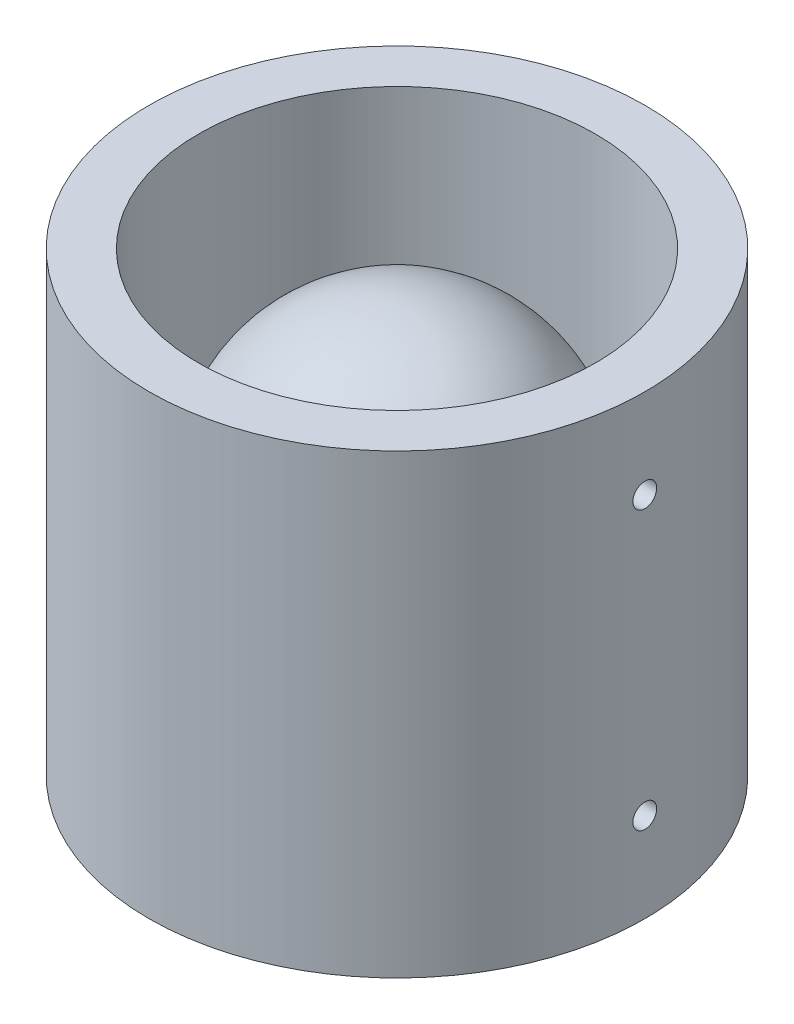
ISO-10303-21;
HEADER;
FILE_DESCRIPTION(('STEP AP214'),'2;1');
FILE_NAME('part.step','',(''),(''),'','','');
FILE_SCHEMA(('AUTOMOTIVE_DESIGN { 1 0 10303 214 1 1 1 1 }'));
ENDSEC;
DATA;
#1=APPLICATION_CONTEXT('core data for automotive mechanical design processes');
#2=APPLICATION_PROTOCOL_DEFINITION('international standard','automotive_design',2000,#1);
#3=PRODUCT_CONTEXT('',#1,'mechanical');
#4=PRODUCT('Part','Part','',(#3));
#5=PRODUCT_RELATED_PRODUCT_CATEGORY('part','',(#4));
#6=PRODUCT_DEFINITION_FORMATION('','',#4);
#7=PRODUCT_DEFINITION_CONTEXT('part definition',#1,'design');
#8=PRODUCT_DEFINITION('design','',#6,#7);
#9=PRODUCT_DEFINITION_SHAPE('','',#8);
#10=(LENGTH_UNIT() NAMED_UNIT(*) SI_UNIT(.MILLI.,.METRE.));
#11=(NAMED_UNIT(*) PLANE_ANGLE_UNIT() SI_UNIT($,.RADIAN.));
#12=(NAMED_UNIT(*) SI_UNIT($,.STERADIAN.) SOLID_ANGLE_UNIT());
#13=UNCERTAINTY_MEASURE_WITH_UNIT(LENGTH_MEASURE(1.E-05),#10,'distance_accuracy_value','');
#14=(GEOMETRIC_REPRESENTATION_CONTEXT(3) GLOBAL_UNCERTAINTY_ASSIGNED_CONTEXT((#13)) GLOBAL_UNIT_ASSIGNED_CONTEXT((#10,
#11,#12)) REPRESENTATION_CONTEXT('',''));
#15=CARTESIAN_POINT('',(0.,0.,0.));
#16=DIRECTION('',(0.,0.,1.));
#17=DIRECTION('',(1.,0.,0.));
#18=AXIS2_PLACEMENT_3D('',#15,#16,#17);
#19=CARTESIAN_POINT('',(0.,12.0756756756757,0.));
#20=DIRECTION('',(0.,-1.,0.));
#21=DIRECTION('',(1.,0.,0.));
#22=AXIS2_PLACEMENT_3D('',#19,#20,#21);
#23=SPHERICAL_SURFACE('',#22,6.82432432432432);
#24=CARTESIAN_POINT('',(0.,11.5,0.));
#25=DIRECTION('',(0.,-1.,0.));
#26=DIRECTION('',(0.,0.,-1.));
#27=AXIS2_PLACEMENT_3D('',#24,#25,#26);
#28=CIRCLE('',#27,6.8);
#29=CARTESIAN_POINT('',(0.,11.5,-6.8));
#30=VERTEX_POINT('',#29);
#31=EDGE_CURVE('E10',#30,#30,#28,.T.);
#32=ORIENTED_EDGE('',*,*,#31,.T.);
#33=EDGE_LOOP('',(#32));
#34=FACE_BOUND('',#33,.T.);
#35=ADVANCED_FACE('F37',(#34),#23,.F.);
#36=CARTESIAN_POINT('',(0.,11.5,0.));
#37=DIRECTION('',(0.,1.,0.));
#38=DIRECTION('',(0.,0.,1.));
#39=AXIS2_PLACEMENT_3D('',#36,#37,#38);
#40=PLANE('',#39);
#41=ORIENTED_EDGE('',*,*,#31,.F.);
#42=EDGE_LOOP('',(#41));
#43=FACE_BOUND('',#42,.T.);
#44=CARTESIAN_POINT('',(0.,11.5,0.));
#45=DIRECTION('',(0.,-1.,0.));
#46=DIRECTION('',(0.,0.,-1.));
#47=AXIS2_PLACEMENT_3D('',#44,#45,#46);
#48=CIRCLE('',#47,9.99999999999999);
#49=CARTESIAN_POINT('',(0.,11.5,-9.99999999999999));
#50=VERTEX_POINT('',#49);
#51=EDGE_CURVE('E43',#50,#50,#48,.T.);
#52=ORIENTED_EDGE('',*,*,#51,.T.);
#53=EDGE_LOOP('',(#52));
#54=FACE_BOUND('',#53,.T.);
#55=ADVANCED_FACE('F128',(#43,#54),#40,.F.);
#56=CARTESIAN_POINT('',(0.,0.,0.));
#57=DIRECTION('',(0.,-1.,0.));
#58=DIRECTION('',(0.,0.,-1.));
#59=AXIS2_PLACEMENT_3D('',#56,#57,#58);
#60=CYLINDRICAL_SURFACE('',#59,9.99999999999999);
#61=CARTESIAN_POINT('',(9.98198377077422,4.5,-0.6));
#62=CARTESIAN_POINT('',(9.98198401201266,4.46633029699841,-0.599998517471414));
#63=CARTESIAN_POINT('',(9.98215595678526,4.43263695259193,-0.597156354895668));
#64=CARTESIAN_POINT('',(9.98282524653582,4.36618043051532,-0.585859096831607));
#65=CARTESIAN_POINT('',(9.9833229712693,4.33341838500508,-0.577397450649356));
#66=CARTESIAN_POINT('',(9.98458724111525,4.26979672371531,-0.555104977990247));
#67=CARTESIAN_POINT('',(9.98535364536831,4.2389361210232,-0.541276964509292));
#68=CARTESIAN_POINT('',(9.98706873955508,4.17998219709892,-0.508648784748044));
#69=CARTESIAN_POINT('',(9.98801738745489,4.1518882400046,-0.489849764638794));
#70=CARTESIAN_POINT('',(9.98999157888623,4.09921773322034,-0.447784352817085));
#71=CARTESIAN_POINT('',(9.99101721555019,4.07464555177201,-0.42451249550801));
#72=CARTESIAN_POINT('',(9.99302894926315,4.02975346763584,-0.374173227142782));
#73=CARTESIAN_POINT('',(9.99401504466929,4.00943374148068,-0.347105658592687));
#74=CARTESIAN_POINT('',(9.99583736833412,3.97361026358255,-0.289919070083357));
#75=CARTESIAN_POINT('',(9.99667348547989,3.95811007626022,-0.25979781341439));
#76=CARTESIAN_POINT('',(9.99810066684227,3.93238850322372,-0.197374580626783));
#77=CARTESIAN_POINT('',(9.99869173351435,3.92216706461498,-0.165072626363023));
#78=CARTESIAN_POINT('',(9.9995615743073,3.90730512175699,-0.0992465731113257));
#79=CARTESIAN_POINT('',(9.99984072723837,3.90265784734145,-0.0657240077489312));
#80=CARTESIAN_POINT('',(10.0000565601673,3.89905524762713,0.00162647869639034));
#81=CARTESIAN_POINT('',(9.99999324377188,3.90009986238483,0.0354543965597856));
#82=CARTESIAN_POINT('',(9.99953158937064,3.90784579641701,0.102409483640516));
#83=CARTESIAN_POINT('',(9.99913368274436,3.91453983206318,0.135537498876275));
#84=CARTESIAN_POINT('',(9.99804814710845,3.93338328853479,0.200198802329734));
#85=CARTESIAN_POINT('',(9.9973605164938,3.94553273958228,0.231732081711798));
#86=CARTESIAN_POINT('',(9.99577222039045,3.97495040858791,0.292332195931485));
#87=CARTESIAN_POINT('',(9.99487141744278,3.99222193121584,0.321397422804533));
#88=CARTESIAN_POINT('',(9.99295816926915,4.03139106207923,0.376218813487536));
#89=CARTESIAN_POINT('',(9.99194572288875,4.05328871815288,0.401974943074147));
#90=CARTESIAN_POINT('',(9.98992126372086,4.10112966683711,0.449489521907771));
#91=CARTESIAN_POINT('',(9.98890925413119,4.12707928076594,0.471241607059719));
#92=CARTESIAN_POINT('',(9.98700135868553,4.18226537094141,0.510081576134667));
#93=CARTESIAN_POINT('',(9.986105472872,4.21150184838995,0.527169458352121));
#94=CARTESIAN_POINT('',(9.98453098174426,4.27243575001595,0.556195483697502));
#95=CARTESIAN_POINT('',(9.9838523874765,4.30413329920497,0.56813336502597));
#96=CARTESIAN_POINT('',(9.98278940556902,4.36908773863782,0.586516153179477));
#97=CARTESIAN_POINT('',(9.98240501474084,4.40234461197816,0.592961119534703));
#98=CARTESIAN_POINT('',(9.98197438414036,4.46941816230764,0.600167212491188));
#99=CARTESIAN_POINT('',(9.98192761823906,4.50323388595765,0.600937182614));
#100=CARTESIAN_POINT('',(9.98217613712487,4.57051401621661,0.596794526461524));
#101=CARTESIAN_POINT('',(9.98247142027366,4.6039784245075,0.591881927404156));
#102=CARTESIAN_POINT('',(9.98337027924552,4.6695810203571,0.57652092722602));
#103=CARTESIAN_POINT('',(9.98397362853823,4.70172016368206,0.566076593547018));
#104=CARTESIAN_POINT('',(9.98542043237127,4.7637894049039,0.539952719606716));
#105=CARTESIAN_POINT('',(9.98626388891815,4.79371948433721,0.524273135594714));
#106=CARTESIAN_POINT('',(9.98809713085294,4.85056162857903,0.48810122662252));
#107=CARTESIAN_POINT('',(9.98908709594341,4.87746991463933,0.467602972809795));
#108=CARTESIAN_POINT('',(9.99110116089288,4.92746659077687,0.422384230608711));
#109=CARTESIAN_POINT('',(9.99212526106073,4.95055494627977,0.397663704008519));
#110=CARTESIAN_POINT('',(9.99409372687306,4.99228620563304,0.344664096943035));
#111=CARTESIAN_POINT('',(9.99503798891735,5.01092338901876,0.316380507882732));
#112=CARTESIAN_POINT('',(9.99673888695872,5.04318412656692,0.257080341335411));
#113=CARTESIAN_POINT('',(9.99749552403932,5.05680770968266,0.226063779632465));
#114=CARTESIAN_POINT('',(9.99873541734025,5.07864456140467,0.162199199042471));
#115=CARTESIAN_POINT('',(9.9992188568999,5.08686145897782,0.129352424688534));
#116=CARTESIAN_POINT('',(9.99985861043105,5.09766356998899,0.0627424887048632));
#117=CARTESIAN_POINT('',(10.0000149273218,5.10024883368462,0.0289793352557667));
#118=CARTESIAN_POINT('',(9.99998283121432,5.09971380806371,-0.0384482932984699));
#119=CARTESIAN_POINT('',(9.99979495938778,5.09660247557385,-0.0721128400987228));
#120=CARTESIAN_POINT('',(9.99909669083327,5.08478113580375,-0.13844062762014));
#121=CARTESIAN_POINT('',(9.99858629352841,5.07607111850935,-0.171103866550195));
#122=CARTESIAN_POINT('',(9.99730035413457,5.05330163934932,-0.234503300307763));
#123=CARTESIAN_POINT('',(9.99652481296466,5.03924219602669,-0.265239501814638));
#124=CARTESIAN_POINT('',(9.99479569274723,5.00617425762829,-0.32391619783375));
#125=CARTESIAN_POINT('',(9.99384211850181,4.98716589603499,-0.351856767721767));
#126=CARTESIAN_POINT('',(9.99186243901885,4.94470676574869,-0.404194384504062));
#127=CARTESIAN_POINT('',(9.99083623006023,4.92124956056174,-0.428586205652784));
#128=CARTESIAN_POINT('',(9.98882774883929,4.87056652217833,-0.473094054248563));
#129=CARTESIAN_POINT('',(9.98784548740359,4.84333976702956,-0.493209032609014));
#130=CARTESIAN_POINT('',(9.98603481255707,4.78586150200958,-0.528605904532304));
#131=CARTESIAN_POINT('',(9.98520658194916,4.75560646283758,-0.543882070342837));
#132=CARTESIAN_POINT('',(9.98380010736925,4.69297815205819,-0.569119208964382));
#133=CARTESIAN_POINT('',(9.98322157021377,4.6606074163762,-0.579086418650936));
#134=CARTESIAN_POINT('',(9.98253189126873,4.60669829869281,-0.590826934595602));
#135=CARTESIAN_POINT('',(9.98232726196914,4.58550854605257,-0.594262398212309));
#136=CARTESIAN_POINT('',(9.98205312497913,4.5428823925691,-0.598849401611936));
#137=CARTESIAN_POINT('',(9.98198361711686,4.52144599203962,-0.600000944299872));
#138=CARTESIAN_POINT('',(9.98198377077422,4.5,-0.6));
#139=B_SPLINE_CURVE_WITH_KNOTS('',3,(#61,#62,#63,#64,#65,#66,#67,#68,#69,#70,#71,#72,#73,#74,
#75,#76,#77,#78,#79,#80,#81,#82,#83,#84,#85,#86,#87,#88,#89,#90,#91,#92,#93,#94,#95,#96,#97,#98,
#99,#100,#101,#102,#103,#104,#105,#106,#107,#108,#109,#110,#111,#112,#113,#114,#115,#116,#117,
#118,#119,#120,#121,#122,#123,#124,#125,#126,#127,#128,#129,#130,#131,#132,#133,#134,#135,#136,
#137,#138),.UNSPECIFIED.,.T.,.F.,(4,2,2,2,2,2,2,2,2,2,2,2,2,2,2,2,2,2,2,2,2,2,2,2,2,2,2,2,2,2,2,
2,2,2,2,2,2,2,4),(0.,0.100930818882167,0.201979500938155,0.30297528567975,0.403947803974872,
0.505044499524723,0.606145391081563,0.707320877665383,0.808495350422211,0.909546815704642,
1.01059721677675,1.11151753528352,1.21243841287812,1.31342454501592,1.41441172148833,
1.51555804826418,1.61670441202589,1.71785591694087,1.81900632559922,1.91999907506486,
2.02099134080545,2.12190945059531,2.22282840377345,2.323872182797,2.42491687632151,
2.5260907378854,2.62726401516577,2.72836931549229,2.8294737135352,2.93041928041172,
3.03136502784614,3.13231042537013,3.23325310047191,3.33434294704152,3.43545756187376,
3.53669142366835,3.63780609378394,3.70209428460643,3.76638239365798),.UNSPECIFIED.);
#140=CARTESIAN_POINT('',(9.98198377077422,4.5,-0.6));
#141=VERTEX_POINT('',#140);
#142=EDGE_CURVE('E69',#141,#141,#139,.T.);
#143=ORIENTED_EDGE('',*,*,#142,.F.);
#144=EDGE_LOOP('',(#143));
#145=FACE_BOUND('',#144,.T.);
#146=ORIENTED_EDGE('',*,*,#51,.F.);
#147=EDGE_LOOP('',(#146));
#148=FACE_BOUND('',#147,.T.);
#149=CARTESIAN_POINT('',(0.,0.,0.));
#150=DIRECTION('',(0.,-1.,0.));
#151=DIRECTION('',(0.,0.,-1.));
#152=AXIS2_PLACEMENT_3D('',#149,#150,#151);
#153=CIRCLE('',#152,9.99999999999999);
#154=CARTESIAN_POINT('',(0.,0.,-9.99999999999999));
#155=VERTEX_POINT('',#154);
#156=EDGE_CURVE('E47',#155,#155,#153,.T.);
#157=ORIENTED_EDGE('',*,*,#156,.T.);
#158=EDGE_LOOP('',(#157));
#159=FACE_BOUND('',#158,.T.);
#160=ADVANCED_FACE('F114',(#145,#148,#159),#60,.F.);
#161=CARTESIAN_POINT('',(0.,0.,0.));
#162=DIRECTION('',(0.,1.,0.));
#163=DIRECTION('',(0.,0.,1.));
#164=AXIS2_PLACEMENT_3D('',#161,#162,#163);
#165=PLANE('',#164);
#166=ORIENTED_EDGE('',*,*,#156,.F.);
#167=EDGE_LOOP('',(#166));
#168=FACE_BOUND('',#167,.T.);
#169=CARTESIAN_POINT('',(0.,0.,0.));
#170=DIRECTION('',(0.,-1.,0.));
#171=DIRECTION('',(0.,0.,-1.));
#172=AXIS2_PLACEMENT_3D('',#169,#170,#171);
#173=CIRCLE('',#172,12.5);
#174=CARTESIAN_POINT('',(0.,0.,-12.5));
#175=VERTEX_POINT('',#174);
#176=EDGE_CURVE('E51',#175,#175,#173,.T.);
#177=ORIENTED_EDGE('',*,*,#176,.T.);
#178=EDGE_LOOP('',(#177));
#179=FACE_BOUND('',#178,.T.);
#180=ADVANCED_FACE('F136',(#168,#179),#165,.F.);
#181=CARTESIAN_POINT('',(0.,0.,0.));
#182=DIRECTION('',(0.,-1.,0.));
#183=DIRECTION('',(0.,0.,-1.));
#184=AXIS2_PLACEMENT_3D('',#181,#182,#183);
#185=CYLINDRICAL_SURFACE('',#184,12.5);
#186=CARTESIAN_POINT('',(12.4855916960311,18.5,-0.6));
#187=CARTESIAN_POINT('',(12.4855918896883,18.4663185715794,-0.599998512917761));
#188=CARTESIAN_POINT('',(12.4857294505411,18.4326132151237,-0.597154378635558));
#189=CARTESIAN_POINT('',(12.4862649314358,18.3661321948238,-0.585848831179223));
#190=CARTESIAN_POINT('',(12.4866631587567,18.3333576759052,-0.577380788256306));
#191=CARTESIAN_POINT('',(12.4876747598637,18.2697110031604,-0.555070326476095));
#192=CARTESIAN_POINT('',(12.4882880245007,18.2388378935406,-0.541230633795579));
#193=CARTESIAN_POINT('',(12.4896604596653,18.1798614296477,-0.508573882821275));
#194=CARTESIAN_POINT('',(12.4904195955968,18.1517574210148,-0.489758004328909));
#195=CARTESIAN_POINT('',(12.4919990539936,18.0990819914248,-0.447663146868994));
#196=CARTESIAN_POINT('',(12.4928194263969,18.0745135025258,-0.424380500452055));
#197=CARTESIAN_POINT('',(12.4944284449003,18.0296314976752,-0.374020288211566));
#198=CARTESIAN_POINT('',(12.4952170897083,18.0093181548822,-0.346942568026376));
#199=CARTESIAN_POINT('',(12.4966741535277,17.9735152339121,-0.289745805730813));
#200=CARTESIAN_POINT('',(12.4973425164835,17.9580279023802,-0.259625355757314));
#201=CARTESIAN_POINT('',(12.49848319957,17.9323310623821,-0.197208063463376));
#202=CARTESIAN_POINT('',(12.4989555210989,17.9221215162778,-0.164911236665444));
#203=CARTESIAN_POINT('',(12.4996505638684,17.9072777018632,-0.099084615957952));
#204=CARTESIAN_POINT('',(12.4998734790519,17.9026391012788,-0.0655558010504624));
#205=CARTESIAN_POINT('',(12.5000452382189,17.8990554826695,0.00180527272665131));
#206=CARTESIAN_POINT('',(12.4999940842291,17.9001104225428,0.035637529350579));
#207=CARTESIAN_POINT('',(12.4996236333111,17.9078803393626,0.102615778199374));
#208=CARTESIAN_POINT('',(12.4993045573349,17.9145906524079,0.135762312858473));
#209=CARTESIAN_POINT('',(12.4984344594818,17.9334736060071,0.200457923384205));
#210=CARTESIAN_POINT('',(12.4978834366887,17.9456462681398,0.232006992939619));
#211=CARTESIAN_POINT('',(12.4966111378463,17.9751137049862,0.292627131564541));
#212=CARTESIAN_POINT('',(12.4958897911388,17.9924106062348,0.321697165382983));
#213=CARTESIAN_POINT('',(12.4943580865466,18.0316339708175,0.376522722918218));
#214=CARTESIAN_POINT('',(12.4935477280856,18.0535604641382,0.402278225164572));
#215=CARTESIAN_POINT('',(12.4919283017692,18.1014469700679,0.449770813851838));
#216=CARTESIAN_POINT('',(12.4911192360401,18.1274110289155,0.471503820775185));
#217=CARTESIAN_POINT('',(12.4895944291365,18.1826214208251,0.510303074489402));
#218=CARTESIAN_POINT('',(12.4888786879854,18.2118677547094,0.527369320111178));
#219=CARTESIAN_POINT('',(12.4876213054447,18.272814943283,0.556350236901598));
#220=CARTESIAN_POINT('',(12.4870796691525,18.3045158698017,0.568264757246676));
#221=CARTESIAN_POINT('',(12.4862317730225,18.369471268165,0.586601301562367));
#222=CARTESIAN_POINT('',(12.4859255115531,18.4027257292391,0.593023363606067));
#223=CARTESIAN_POINT('',(12.4855832028151,18.4698086932741,0.600187651964552));
#224=CARTESIAN_POINT('',(12.4855468862309,18.5036365903458,0.600935539243081));
#225=CARTESIAN_POINT('',(12.4857478595934,18.5709374065809,0.596745018744902));
#226=CARTESIAN_POINT('',(12.4859851487075,18.6044103268241,0.591806628273176));
#227=CARTESIAN_POINT('',(12.4867063423603,18.6700351280227,0.57638842930482));
#228=CARTESIAN_POINT('',(12.4871901316811,18.7021876185868,0.565911209656163));
#229=CARTESIAN_POINT('',(12.4883496991297,18.7642776416038,0.539715382388136));
#230=CARTESIAN_POINT('',(12.4890254782804,18.7942151622571,0.523996746848704));
#231=CARTESIAN_POINT('',(12.4904935129661,18.8510514776141,0.487749745205263));
#232=CARTESIAN_POINT('',(12.4912858604339,18.8779478439968,0.46721757520265));
#233=CARTESIAN_POINT('',(12.4928974004797,18.9279139394505,0.421931898159006));
#234=CARTESIAN_POINT('',(12.4937165932167,18.9509836458613,0.397178366122379));
#235=CARTESIAN_POINT('',(12.4952902776994,18.9926605652455,0.344128320465761));
#236=CARTESIAN_POINT('',(12.4960447161181,19.0112641224435,0.315828933018126));
#237=CARTESIAN_POINT('',(12.4974031019312,19.0434556664845,0.256505031415091));
#238=CARTESIAN_POINT('',(12.4980070499421,19.0570436738766,0.225480528425313));
#239=CARTESIAN_POINT('',(12.4989961330746,19.0788120084365,0.161600689378359));
#240=CARTESIAN_POINT('',(12.4993813629622,19.0869946778817,0.128746153024631));
#241=CARTESIAN_POINT('',(12.4998899701937,19.0977277320963,0.0621276568503126));
#242=CARTESIAN_POINT('',(12.5000133488619,19.1002781453525,0.0283637016302646));
#243=CARTESIAN_POINT('',(12.4999843548525,19.0996740144457,-0.0390788930102092));
#244=CARTESIAN_POINT('',(12.4998322594574,19.0965252069227,-0.0727575840880945));
#245=CARTESIAN_POINT('',(12.4992699872854,19.0846238704801,-0.139107601703904));
#246=CARTESIAN_POINT('',(12.4988598100185,19.0758713309242,-0.171778926329649));
#247=CARTESIAN_POINT('',(12.4978275280033,19.05301213286,-0.235188056600191));
#248=CARTESIAN_POINT('',(12.497205421369,19.0389054267074,-0.265925845036508));
#249=CARTESIAN_POINT('',(12.4958192608692,19.0057393772527,-0.324597002582852));
#250=CARTESIAN_POINT('',(12.495055211456,18.9866801892847,-0.352530459612366));
#251=CARTESIAN_POINT('',(12.4934703013177,18.9441298346345,-0.404828570429238));
#252=CARTESIAN_POINT('',(12.4926493902265,18.9206347061204,-0.429189999140271));
#253=CARTESIAN_POINT('',(12.4910436029896,18.8698813142214,-0.473630260691662));
#254=CARTESIAN_POINT('',(12.4902587357664,18.8426221256764,-0.493708037565163));
#255=CARTESIAN_POINT('',(12.4888130623952,18.7850942891104,-0.529019738769725));
#256=CARTESIAN_POINT('',(12.4881523711949,18.75482289199,-0.544249184041057));
#257=CARTESIAN_POINT('',(12.4870314075069,18.6921723861485,-0.569391344061627));
#258=CARTESIAN_POINT('',(12.4865708981327,18.6597958210597,-0.579310346197391));
#259=CARTESIAN_POINT('',(12.4860243035495,18.6060147324879,-0.590944972284193));
#260=CARTESIAN_POINT('',(12.4858627898815,18.5849586542844,-0.59433628013077));
#261=CARTESIAN_POINT('',(12.4856464249093,18.5426049092342,-0.598864263475562));
#262=CARTESIAN_POINT('',(12.4855915735214,18.5213072425774,-0.600000940744603));
#263=CARTESIAN_POINT('',(12.4855916960311,18.5,-0.6));
#264=B_SPLINE_CURVE_WITH_KNOTS('',3,(#186,#187,#188,#189,#190,#191,#192,#193,#194,#195,#196,
#197,#198,#199,#200,#201,#202,#203,#204,#205,#206,#207,#208,#209,#210,#211,#212,#213,#214,#215,
#216,#217,#218,#219,#220,#221,#222,#223,#224,#225,#226,#227,#228,#229,#230,#231,#232,#233,#234,
#235,#236,#237,#238,#239,#240,#241,#242,#243,#244,#245,#246,#247,#248,#249,#250,#251,#252,#253,
#254,#255,#256,#257,#258,#259,#260,#261,#262,#263),.UNSPECIFIED.,.T.,.F.,(4,2,2,2,2,2,2,2,2,2,2,
2,2,2,2,2,2,2,2,2,2,2,2,2,2,2,2,2,2,2,2,2,2,2,2,2,2,2,4),(0.,0.100966506293557,
0.202052248799716,0.303086756017561,0.404097330455401,0.505191197549289,0.606289177750642,
0.707434151864276,0.808578404661043,0.909643951078531,1.01070875015131,1.11169028406668,
1.21267221690589,1.31369611561056,1.41472066868172,1.51584712362973,1.6169736039114,
1.718103044604,1.81923178427331,1.92025961737409,2.02128714301886,2.12226749010712,
2.22324837510779,2.32430933092067,2.42537088515811,2.52651488360754,2.62765846765879,
2.7287581946899,2.82985741037668,2.93085491965103,3.03185262062674,3.13285122035524,
3.23384665265504,3.33493271649028,3.43604367042364,3.53724776496232,3.63833177077141,
3.70220434483829,3.76607686873858),.UNSPECIFIED.);
#265=CARTESIAN_POINT('',(12.4855916960311,18.5,-0.6));
#266=VERTEX_POINT('',#265);
#267=EDGE_CURVE('E68',#266,#266,#264,.T.);
#268=ORIENTED_EDGE('',*,*,#267,.T.);
#269=EDGE_LOOP('',(#268));
#270=FACE_BOUND('',#269,.T.);
#271=CARTESIAN_POINT('',(12.4855916960311,4.5,-0.6));
#272=CARTESIAN_POINT('',(12.4855918896883,4.46631857157943,-0.599998512917761));
#273=CARTESIAN_POINT('',(12.4857294505411,4.43261321512374,-0.597154378635558));
#274=CARTESIAN_POINT('',(12.4862649314358,4.3661321948238,-0.585848831179223));
#275=CARTESIAN_POINT('',(12.4866631587567,4.33335767590515,-0.577380788256305));
#276=CARTESIAN_POINT('',(12.4876747598637,4.26971100316039,-0.555070326476095));
#277=CARTESIAN_POINT('',(12.4882880245007,4.23883789354058,-0.541230633795579));
#278=CARTESIAN_POINT('',(12.4896604596653,4.17986142964771,-0.508573882821274));
#279=CARTESIAN_POINT('',(12.4904195955968,4.15175742101482,-0.489758004328908));
#280=CARTESIAN_POINT('',(12.4919990539936,4.09908199142485,-0.447663146868993));
#281=CARTESIAN_POINT('',(12.4928194263969,4.07451350252578,-0.424380500452053));
#282=CARTESIAN_POINT('',(12.4944284449003,4.02963149767518,-0.374020288211563));
#283=CARTESIAN_POINT('',(12.4952170897083,4.00931815488223,-0.346942568026372));
#284=CARTESIAN_POINT('',(12.4966741535277,3.97351523391209,-0.289745805730808));
#285=CARTESIAN_POINT('',(12.4973425164835,3.95802790238021,-0.259625355757309));
#286=CARTESIAN_POINT('',(12.49848319957,3.9323310623821,-0.197208063463373));
#287=CARTESIAN_POINT('',(12.4989555210989,3.92212151627778,-0.164911236665441));
#288=CARTESIAN_POINT('',(12.4996505638684,3.90727770186323,-0.0990846159579503));
#289=CARTESIAN_POINT('',(12.4998734790519,3.90263910127884,-0.0655558010504606));
#290=CARTESIAN_POINT('',(12.5000452382189,3.89905548266955,0.00180527272665343));
#291=CARTESIAN_POINT('',(12.4999940842291,3.90011042254284,0.0356375293505814));
#292=CARTESIAN_POINT('',(12.4996236333111,3.90788033936264,0.102615778199376));
#293=CARTESIAN_POINT('',(12.4993045573349,3.91459065240786,0.135762312858475));
#294=CARTESIAN_POINT('',(12.4984344594818,3.93347360600713,0.200457923384207));
#295=CARTESIAN_POINT('',(12.4978834366887,3.94564626813979,0.232006992939622));
#296=CARTESIAN_POINT('',(12.4966111378463,3.97511370498625,0.292627131564544));
#297=CARTESIAN_POINT('',(12.4958897911388,3.99241060623485,0.321697165382985));
#298=CARTESIAN_POINT('',(12.4943580865466,4.03163397081753,0.376522722918221));
#299=CARTESIAN_POINT('',(12.4935477280856,4.05356046413816,0.402278225164575));
#300=CARTESIAN_POINT('',(12.4919283017692,4.10144697006792,0.449770813851841));
#301=CARTESIAN_POINT('',(12.4911192360401,4.12741102891551,0.471503820775188));
#302=CARTESIAN_POINT('',(12.4895944291366,4.18262142082513,0.510303074489404));
#303=CARTESIAN_POINT('',(12.4888786879854,4.21186775470941,0.527369320111179));
#304=CARTESIAN_POINT('',(12.4876213054447,4.27281494328299,0.556350236901599));
#305=CARTESIAN_POINT('',(12.4870796691525,4.3045158698017,0.568264757246677));
#306=CARTESIAN_POINT('',(12.4862317730225,4.36947126816504,0.586601301562368));
#307=CARTESIAN_POINT('',(12.4859255115531,4.40272572923906,0.593023363606068));
#308=CARTESIAN_POINT('',(12.4855832028151,4.46980869327411,0.600187651964552));
#309=CARTESIAN_POINT('',(12.4855468862309,4.50363659034585,0.600935539243081));
#310=CARTESIAN_POINT('',(12.4857478595934,4.57093740658088,0.596745018744901));
#311=CARTESIAN_POINT('',(12.4859851487075,4.60441032682415,0.591806628273175));
#312=CARTESIAN_POINT('',(12.4867063423603,4.67003512802274,0.57638842930482));
#313=CARTESIAN_POINT('',(12.4871901316811,4.70218761858676,0.565911209656163));
#314=CARTESIAN_POINT('',(12.4883496991297,4.76427764160383,0.539715382388136));
#315=CARTESIAN_POINT('',(12.4890254782804,4.7942151622571,0.523996746848703));
#316=CARTESIAN_POINT('',(12.4904935129661,4.85105147761409,0.487749745205261));
#317=CARTESIAN_POINT('',(12.4912858604339,4.87794784399681,0.467217575202648));
#318=CARTESIAN_POINT('',(12.4928974004797,4.92791393945047,0.421931898159005));
#319=CARTESIAN_POINT('',(12.4937165932167,4.95098364586134,0.397178366122377));
#320=CARTESIAN_POINT('',(12.4952902776994,4.99266056524553,0.344128320465758));
#321=CARTESIAN_POINT('',(12.4960447161181,5.01126412244347,0.315828933018124));
#322=CARTESIAN_POINT('',(12.4974031019312,5.04345566648449,0.256505031415089));
#323=CARTESIAN_POINT('',(12.4980070499421,5.0570436738766,0.225480528425311));
#324=CARTESIAN_POINT('',(12.4989961330746,5.07881200843647,0.161600689378357));
#325=CARTESIAN_POINT('',(12.4993813629622,5.0869946778817,0.128746153024628));
#326=CARTESIAN_POINT('',(12.4998899701937,5.09772773209626,0.0621276568503092));
#327=CARTESIAN_POINT('',(12.5000133488619,5.10027814535247,0.0283637016302609));
#328=CARTESIAN_POINT('',(12.4999843548525,5.09967401444569,-0.0390788930102128));
#329=CARTESIAN_POINT('',(12.4998322594574,5.09652520692267,-0.0727575840880979));
#330=CARTESIAN_POINT('',(12.4992699872854,5.08462387048006,-0.139107601703907));
#331=CARTESIAN_POINT('',(12.4988598100185,5.07587133092418,-0.171778926329652));
#332=CARTESIAN_POINT('',(12.4978275280033,5.05301213285999,-0.235188056600194));
#333=CARTESIAN_POINT('',(12.497205421369,5.03890542670743,-0.265925845036511));
#334=CARTESIAN_POINT('',(12.4958192608692,5.00573937725274,-0.324597002582855));
#335=CARTESIAN_POINT('',(12.495055211456,4.98668018928471,-0.352530459612368));
#336=CARTESIAN_POINT('',(12.4934703013177,4.9441298346345,-0.40482857042924));
#337=CARTESIAN_POINT('',(12.4926493902265,4.92063470612038,-0.429189999140272));
#338=CARTESIAN_POINT('',(12.4910436029896,4.86988131422143,-0.473630260691662));
#339=CARTESIAN_POINT('',(12.4902587357664,4.84262212567638,-0.493708037565164));
#340=CARTESIAN_POINT('',(12.4888130623952,4.78509428911043,-0.529019738769726));
#341=CARTESIAN_POINT('',(12.4881523711949,4.75482289198995,-0.544249184041058));
#342=CARTESIAN_POINT('',(12.4870314075069,4.69217238614846,-0.569391344061629));
#343=CARTESIAN_POINT('',(12.4865708981327,4.65979582105969,-0.579310346197392));
#344=CARTESIAN_POINT('',(12.4860243035495,4.60601473248792,-0.590944972284194));
#345=CARTESIAN_POINT('',(12.4858627898815,4.58495865428436,-0.59433628013077));
#346=CARTESIAN_POINT('',(12.4856464249093,4.54260490923421,-0.598864263475562));
#347=CARTESIAN_POINT('',(12.4855915735214,4.52130724257739,-0.600000940744603));
#348=CARTESIAN_POINT('',(12.4855916960311,4.5,-0.6));
#349=B_SPLINE_CURVE_WITH_KNOTS('',3,(#271,#272,#273,#274,#275,#276,#277,#278,#279,#280,#281,
#282,#283,#284,#285,#286,#287,#288,#289,#290,#291,#292,#293,#294,#295,#296,#297,#298,#299,#300,
#301,#302,#303,#304,#305,#306,#307,#308,#309,#310,#311,#312,#313,#314,#315,#316,#317,#318,#319,
#320,#321,#322,#323,#324,#325,#326,#327,#328,#329,#330,#331,#332,#333,#334,#335,#336,#337,#338,
#339,#340,#341,#342,#343,#344,#345,#346,#347,#348),.UNSPECIFIED.,.T.,.F.,(4,2,2,2,2,2,2,2,2,2,2,
2,2,2,2,2,2,2,2,2,2,2,2,2,2,2,2,2,2,2,2,2,2,2,2,2,2,2,4),(0.,0.10096650629356,0.202052248799718,
0.303086756017561,0.404097330455402,0.505191197549293,0.606289177750649,0.70743415186428,
0.808578404661045,0.909643951078534,1.01070875015131,1.11169028406668,1.21267221690589,
1.31369611561056,1.41472066868172,1.51584712362974,1.6169736039114,1.71810304460401,
1.81923178427332,1.92025961737409,2.02128714301886,2.12226749010712,2.22324837510779,
2.32430933092067,2.42537088515812,2.52651488360754,2.62765846765879,2.72875819468991,
2.82985741037668,2.93085491965104,3.03185262062675,3.13285122035524,3.23384665265504,
3.33493271649029,3.43604367042364,3.53724776496233,3.63833177077141,3.70220434483829,
3.76607686873858),.UNSPECIFIED.);
#350=CARTESIAN_POINT('',(12.4855916960311,4.5,-0.6));
#351=VERTEX_POINT('',#350);
#352=EDGE_CURVE('E78',#351,#351,#349,.T.);
#353=ORIENTED_EDGE('',*,*,#352,.T.);
#354=EDGE_LOOP('',(#353));
#355=FACE_BOUND('',#354,.T.);
#356=CARTESIAN_POINT('',(0.,23.,0.));
#357=DIRECTION('',(0.,-1.,0.));
#358=DIRECTION('',(0.,0.,-1.));
#359=AXIS2_PLACEMENT_3D('',#356,#357,#358);
#360=CIRCLE('',#359,12.5);
#361=CARTESIAN_POINT('',(0.,23.,-12.5));
#362=VERTEX_POINT('',#361);
#363=EDGE_CURVE('E56',#362,#362,#360,.T.);
#364=ORIENTED_EDGE('',*,*,#363,.T.);
#365=EDGE_LOOP('',(#364));
#366=FACE_BOUND('',#365,.T.);
#367=ORIENTED_EDGE('',*,*,#176,.F.);
#368=EDGE_LOOP('',(#367));
#369=FACE_BOUND('',#368,.T.);
#370=ADVANCED_FACE('F141',(#270,#355,#366,#369),#185,.T.);
#371=CARTESIAN_POINT('',(0.,23.,0.));
#372=DIRECTION('',(0.,1.,0.));
#373=DIRECTION('',(0.,0.,1.));
#374=AXIS2_PLACEMENT_3D('',#371,#372,#373);
#375=PLANE('',#374);
#376=CARTESIAN_POINT('',(0.,23.,0.));
#377=DIRECTION('',(0.,-1.,0.));
#378=DIRECTION('',(0.,0.,-1.));
#379=AXIS2_PLACEMENT_3D('',#376,#377,#378);
#380=CIRCLE('',#379,9.99999999999999);
#381=CARTESIAN_POINT('',(0.,23.,-9.99999999999999));
#382=VERTEX_POINT('',#381);
#383=EDGE_CURVE('E59',#382,#382,#380,.T.);
#384=ORIENTED_EDGE('',*,*,#383,.T.);
#385=EDGE_LOOP('',(#384));
#386=FACE_BOUND('',#385,.T.);
#387=ORIENTED_EDGE('',*,*,#363,.F.);
#388=EDGE_LOOP('',(#387));
#389=FACE_BOUND('',#388,.T.);
#390=ADVANCED_FACE('F112',(#386,#389),#375,.T.);
#391=CARTESIAN_POINT('',(9.98198377077422,18.5,-0.6));
#392=CARTESIAN_POINT('',(9.98198401201266,18.4663302969984,-0.599998517471414));
#393=CARTESIAN_POINT('',(9.98215595678526,18.4326369525919,-0.597156354895668));
#394=CARTESIAN_POINT('',(9.98282524653582,18.3661804305153,-0.585859096831607));
#395=CARTESIAN_POINT('',(9.9833229712693,18.3334183850051,-0.577397450649356));
#396=CARTESIAN_POINT('',(9.98458724111525,18.2697967237153,-0.555104977990248));
#397=CARTESIAN_POINT('',(9.98535364536831,18.2389361210232,-0.541276964509292));
#398=CARTESIAN_POINT('',(9.98706873955508,18.1799821970989,-0.508648784748045));
#399=CARTESIAN_POINT('',(9.98801738745489,18.1518882400046,-0.489849764638794));
#400=CARTESIAN_POINT('',(9.98999157888623,18.0992177332203,-0.447784352817084));
#401=CARTESIAN_POINT('',(9.99101721555019,18.074645551772,-0.424512495508009));
#402=CARTESIAN_POINT('',(9.99302894926315,18.0297534676358,-0.374173227142781));
#403=CARTESIAN_POINT('',(9.99401504466929,18.0094337414807,-0.347105658592686));
#404=CARTESIAN_POINT('',(9.99583736833412,17.9736102635826,-0.289919070083356));
#405=CARTESIAN_POINT('',(9.99667348547989,17.9581100762602,-0.259797813414389));
#406=CARTESIAN_POINT('',(9.99810066684227,17.9323885032237,-0.197374580626782));
#407=CARTESIAN_POINT('',(9.99869173351435,17.922167064615,-0.165072626363024));
#408=CARTESIAN_POINT('',(9.9995615743073,17.907305121757,-0.0992465731113275));
#409=CARTESIAN_POINT('',(9.99984072723837,17.9026578473415,-0.0657240077489329));
#410=CARTESIAN_POINT('',(10.0000565601673,17.8990552476271,0.00162647869638888));
#411=CARTESIAN_POINT('',(9.99999324377188,17.9000998623848,0.0354543965597842));
#412=CARTESIAN_POINT('',(9.99953158937064,17.907845796417,0.102409483640514));
#413=CARTESIAN_POINT('',(9.99913368274436,17.9145398320632,0.135537498876273));
#414=CARTESIAN_POINT('',(9.99804814710845,17.9333832885348,0.200198802329732));
#415=CARTESIAN_POINT('',(9.9973605164938,17.9455327395823,0.231732081711797));
#416=CARTESIAN_POINT('',(9.99577222039045,17.9749504085879,0.292332195931484));
#417=CARTESIAN_POINT('',(9.99487141744278,17.9922219312158,0.321397422804531));
#418=CARTESIAN_POINT('',(9.99295816926915,18.0313910620792,0.376218813487534));
#419=CARTESIAN_POINT('',(9.99194572288875,18.0532887181529,0.401974943074146));
#420=CARTESIAN_POINT('',(9.98992126372086,18.1011296668371,0.44948952190777));
#421=CARTESIAN_POINT('',(9.98890925413119,18.1270792807659,0.471241607059717));
#422=CARTESIAN_POINT('',(9.98700135868553,18.1822653709414,0.510081576134666));
#423=CARTESIAN_POINT('',(9.986105472872,18.2115018483899,0.527169458352121));
#424=CARTESIAN_POINT('',(9.98453098174427,18.2724357500159,0.556195483697502));
#425=CARTESIAN_POINT('',(9.9838523874765,18.304133299205,0.568133365025969));
#426=CARTESIAN_POINT('',(9.98278940556902,18.3690877386378,0.586516153179477));
#427=CARTESIAN_POINT('',(9.98240501474084,18.4023446119782,0.592961119534703));
#428=CARTESIAN_POINT('',(9.98197438414036,18.4694181623076,0.600167212491188));
#429=CARTESIAN_POINT('',(9.98192761823906,18.5032338859577,0.600937182614));
#430=CARTESIAN_POINT('',(9.98217613712487,18.5705140162166,0.596794526461525));
#431=CARTESIAN_POINT('',(9.98247142027366,18.6039784245075,0.591881927404156));
#432=CARTESIAN_POINT('',(9.98337027924552,18.6695810203571,0.576520927226021));
#433=CARTESIAN_POINT('',(9.98397362853823,18.7017201636821,0.566076593547019));
#434=CARTESIAN_POINT('',(9.98542043237127,18.7637894049039,0.539952719606718));
#435=CARTESIAN_POINT('',(9.98626388891815,18.7937194843372,0.524273135594715));
#436=CARTESIAN_POINT('',(9.98809713085294,18.850561628579,0.488101226622522));
#437=CARTESIAN_POINT('',(9.98908709594341,18.8774699146393,0.467602972809799));
#438=CARTESIAN_POINT('',(9.99110116089288,18.9274665907769,0.422384230608714));
#439=CARTESIAN_POINT('',(9.99212526106073,18.9505549462798,0.397663704008521));
#440=CARTESIAN_POINT('',(9.99409372687306,18.992286205633,0.344664096943036));
#441=CARTESIAN_POINT('',(9.99503798891735,19.0109233890188,0.316380507882733));
#442=CARTESIAN_POINT('',(9.99673888695872,19.0431841265669,0.257080341335412));
#443=CARTESIAN_POINT('',(9.99749552403932,19.0568077096827,0.226063779632466));
#444=CARTESIAN_POINT('',(9.99873541734025,19.0786445614047,0.162199199042472));
#445=CARTESIAN_POINT('',(9.9992188568999,19.0868614589778,0.129352424688534));
#446=CARTESIAN_POINT('',(9.99985861043105,19.097663569989,0.062742488704864));
#447=CARTESIAN_POINT('',(10.0000149273218,19.1002488336846,0.0289793352557677));
#448=CARTESIAN_POINT('',(9.99998283121432,19.0997138080637,-0.0384482932984686));
#449=CARTESIAN_POINT('',(9.99979495938778,19.0966024755739,-0.0721128400987213));
#450=CARTESIAN_POINT('',(9.99909669083327,19.0847811358038,-0.138440627620139));
#451=CARTESIAN_POINT('',(9.99858629352841,19.0760711185094,-0.171103866550194));
#452=CARTESIAN_POINT('',(9.99730035413457,19.0533016393493,-0.234503300307762));
#453=CARTESIAN_POINT('',(9.99652481296466,19.0392421960267,-0.265239501814637));
#454=CARTESIAN_POINT('',(9.99479569274723,19.0061742576283,-0.323916197833749));
#455=CARTESIAN_POINT('',(9.99384211850181,18.987165896035,-0.351856767721765));
#456=CARTESIAN_POINT('',(9.99186243901885,18.9447067657487,-0.40419438450406));
#457=CARTESIAN_POINT('',(9.99083623006023,18.9212495605617,-0.428586205652784));
#458=CARTESIAN_POINT('',(9.98882774883929,18.8705665221783,-0.473094054248563));
#459=CARTESIAN_POINT('',(9.98784548740359,18.8433397670296,-0.493209032609014));
#460=CARTESIAN_POINT('',(9.98603481255707,18.7858615020096,-0.528605904532303));
#461=CARTESIAN_POINT('',(9.98520658194916,18.7556064628376,-0.543882070342837));
#462=CARTESIAN_POINT('',(9.98380010736925,18.6929781520582,-0.569119208964381));
#463=CARTESIAN_POINT('',(9.98322157021377,18.6606074163762,-0.579086418650935));
#464=CARTESIAN_POINT('',(9.98253189126873,18.6066982986928,-0.590826934595602));
#465=CARTESIAN_POINT('',(9.98232726196914,18.5855085460526,-0.594262398212309));
#466=CARTESIAN_POINT('',(9.98205312497913,18.5428823925691,-0.598849401611936));
#467=CARTESIAN_POINT('',(9.98198361711686,18.5214459920396,-0.600000944299872));
#468=CARTESIAN_POINT('',(9.98198377077422,18.5,-0.6));
#469=B_SPLINE_CURVE_WITH_KNOTS('',3,(#391,#392,#393,#394,#395,#396,#397,#398,#399,#400,#401,
#402,#403,#404,#405,#406,#407,#408,#409,#410,#411,#412,#413,#414,#415,#416,#417,#418,#419,#420,
#421,#422,#423,#424,#425,#426,#427,#428,#429,#430,#431,#432,#433,#434,#435,#436,#437,#438,#439,
#440,#441,#442,#443,#444,#445,#446,#447,#448,#449,#450,#451,#452,#453,#454,#455,#456,#457,#458,
#459,#460,#461,#462,#463,#464,#465,#466,#467,#468),.UNSPECIFIED.,.T.,.F.,(4,2,2,2,2,2,2,2,2,2,2,
2,2,2,2,2,2,2,2,2,2,2,2,2,2,2,2,2,2,2,2,2,2,2,2,2,2,2,4),(0.,0.100930818882166,
0.201979500938155,0.302975285679749,0.403947803974873,0.505044499524724,0.606145391081564,
0.707320877665385,0.808495350422209,0.909546815704641,1.01059721677675,1.11151753528352,
1.21243841287812,1.31342454501592,1.41441172148833,1.51555804826418,1.61670441202589,
1.71785591694087,1.81900632559922,1.91999907506485,2.02099134080544,2.12190945059531,
2.22282840377344,2.323872182797,2.4249168763215,2.5260907378854,2.62726401516577,
2.72836931549229,2.8294737135352,2.93041928041172,3.03136502784613,3.13231042537013,
3.23325310047191,3.33434294704152,3.43545756187376,3.53669142366835,3.63780609378394,
3.70209428460643,3.76638239365798),.UNSPECIFIED.);
#470=CARTESIAN_POINT('',(9.98198377077422,18.5,-0.6));
#471=VERTEX_POINT('',#470);
#472=EDGE_CURVE('E77',#471,#471,#469,.T.);
#473=ORIENTED_EDGE('',*,*,#472,.F.);
#474=EDGE_LOOP('',(#473));
#475=FACE_BOUND('',#474,.T.);
#476=ORIENTED_EDGE('',*,*,#383,.F.);
#477=EDGE_LOOP('',(#476));
#478=FACE_BOUND('',#477,.T.);
#479=CARTESIAN_POINT('',(0.,12.5,0.));
#480=DIRECTION('',(0.,-1.,0.));
#481=DIRECTION('',(0.,0.,-1.));
#482=AXIS2_PLACEMENT_3D('',#479,#480,#481);
#483=CIRCLE('',#482,9.99999999999999);
#484=CARTESIAN_POINT('',(0.,12.5,-9.99999999999999));
#485=VERTEX_POINT('',#484);
#486=EDGE_CURVE('E62',#485,#485,#483,.T.);
#487=ORIENTED_EDGE('',*,*,#486,.T.);
#488=EDGE_LOOP('',(#487));
#489=FACE_BOUND('',#488,.T.);
#490=ADVANCED_FACE('F108',(#475,#478,#489),#60,.F.);
#491=CARTESIAN_POINT('',(0.,12.5,0.));
#492=DIRECTION('',(0.,1.,0.));
#493=DIRECTION('',(0.,0.,1.));
#494=AXIS2_PLACEMENT_3D('',#491,#492,#493);
#495=PLANE('',#494);
#496=CARTESIAN_POINT('',(0.,12.5,0.));
#497=DIRECTION('',(0.,-1.,0.));
#498=DIRECTION('',(0.,0.,-1.));
#499=AXIS2_PLACEMENT_3D('',#496,#497,#498);
#500=CIRCLE('',#499,7.99999999999999);
#501=CARTESIAN_POINT('',(0.,12.5,-7.99999999999999));
#502=VERTEX_POINT('',#501);
#503=EDGE_CURVE('E65',#502,#502,#500,.T.);
#504=ORIENTED_EDGE('',*,*,#503,.T.);
#505=EDGE_LOOP('',(#504));
#506=FACE_BOUND('',#505,.T.);
#507=ORIENTED_EDGE('',*,*,#486,.F.);
#508=EDGE_LOOP('',(#507));
#509=FACE_BOUND('',#508,.T.);
#510=ADVANCED_FACE('F111',(#506,#509),#495,.T.);
#511=CARTESIAN_POINT('',(0.,12.5,0.));
#512=DIRECTION('',(0.,-1.,0.));
#513=DIRECTION('',(-1.,0.,0.));
#514=AXIS2_PLACEMENT_3D('',#511,#512,#513);
#515=SPHERICAL_SURFACE('',#514,7.99999999999995);
#516=ORIENTED_EDGE('',*,*,#503,.F.);
#517=EDGE_LOOP('',(#516));
#518=FACE_BOUND('',#517,.T.);
#519=ADVANCED_FACE('F120',(#518),#515,.T.);
#520=CARTESIAN_POINT('',(-12.501,18.5,0.));
#521=DIRECTION('',(1.,0.,0.));
#522=DIRECTION('',(0.,0.,-1.));
#523=AXIS2_PLACEMENT_3D('',#520,#521,#522);
#524=CYLINDRICAL_SURFACE('',#523,0.6);
#525=ORIENTED_EDGE('',*,*,#267,.F.);
#526=EDGE_LOOP('',(#525));
#527=FACE_BOUND('',#526,.T.);
#528=ORIENTED_EDGE('',*,*,#472,.T.);
#529=EDGE_LOOP('',(#528));
#530=FACE_BOUND('',#529,.T.);
#531=ADVANCED_FACE('F92',(#527,#530),#524,.F.);
#532=CARTESIAN_POINT('',(-12.501,4.5,0.));
#533=DIRECTION('',(1.,0.,0.));
#534=DIRECTION('',(0.,0.,-1.));
#535=AXIS2_PLACEMENT_3D('',#532,#533,#534);
#536=CYLINDRICAL_SURFACE('',#535,0.6);
#537=ORIENTED_EDGE('',*,*,#352,.F.);
#538=EDGE_LOOP('',(#537));
#539=FACE_BOUND('',#538,.T.);
#540=ORIENTED_EDGE('',*,*,#142,.T.);
#541=EDGE_LOOP('',(#540));
#542=FACE_BOUND('',#541,.T.);
#543=ADVANCED_FACE('F84',(#539,#542),#536,.F.);
#544=CLOSED_SHELL('',(#35,#55,#160,#180,#370,#390,#490,#510,#519,#531,#543));
#545=MANIFOLD_SOLID_BREP('B2',#544);
#546=ADVANCED_BREP_SHAPE_REPRESENTATION('',(#18,#545),#14);
#547=SHAPE_DEFINITION_REPRESENTATION(#9,#546);
ENDSEC;
END-ISO-10303-21;
